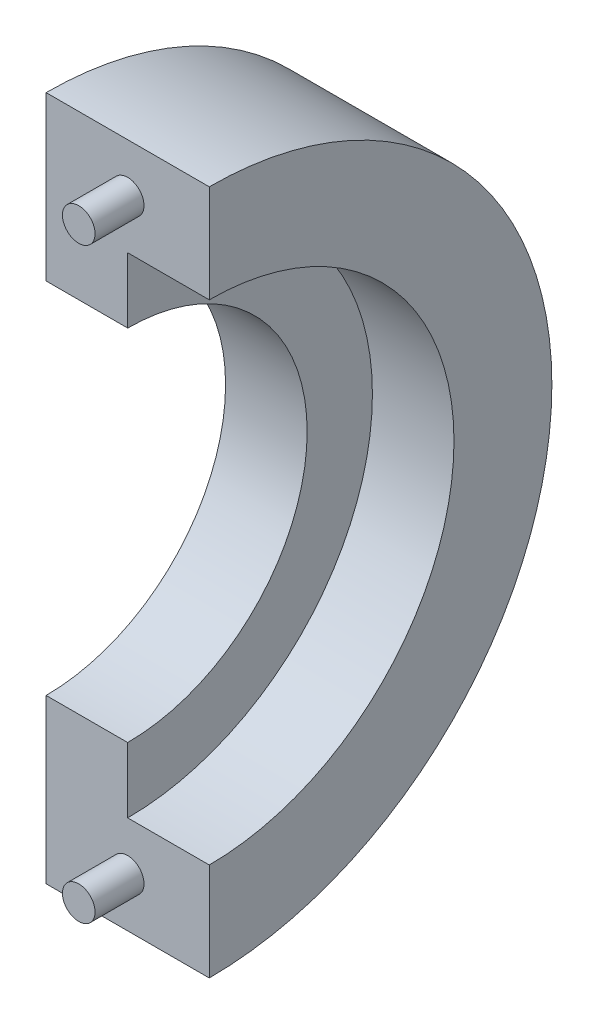
ISO-10303-21;
HEADER;
FILE_DESCRIPTION(('STEP AP214'),'2;1');
FILE_NAME('part.step','',(''),(''),'','','');
FILE_SCHEMA(('AUTOMOTIVE_DESIGN { 1 0 10303 214 1 1 1 1 }'));
ENDSEC;
DATA;
#1=APPLICATION_CONTEXT('core data for automotive mechanical design processes');
#2=APPLICATION_PROTOCOL_DEFINITION('international standard','automotive_design',2000,#1);
#3=PRODUCT_CONTEXT('',#1,'mechanical');
#4=PRODUCT('Part','Part','',(#3));
#5=PRODUCT_RELATED_PRODUCT_CATEGORY('part','',(#4));
#6=PRODUCT_DEFINITION_FORMATION('','',#4);
#7=PRODUCT_DEFINITION_CONTEXT('part definition',#1,'design');
#8=PRODUCT_DEFINITION('design','',#6,#7);
#9=PRODUCT_DEFINITION_SHAPE('','',#8);
#10=(LENGTH_UNIT() NAMED_UNIT(*) SI_UNIT(.MILLI.,.METRE.));
#11=(NAMED_UNIT(*) PLANE_ANGLE_UNIT() SI_UNIT($,.RADIAN.));
#12=(NAMED_UNIT(*) SI_UNIT($,.STERADIAN.) SOLID_ANGLE_UNIT());
#13=UNCERTAINTY_MEASURE_WITH_UNIT(LENGTH_MEASURE(1.E-05),#10,'distance_accuracy_value','');
#14=(GEOMETRIC_REPRESENTATION_CONTEXT(3) GLOBAL_UNCERTAINTY_ASSIGNED_CONTEXT((#13)) GLOBAL_UNIT_ASSIGNED_CONTEXT((#10,
#11,#12)) REPRESENTATION_CONTEXT('',''));
#15=CARTESIAN_POINT('',(0.,0.,0.));
#16=DIRECTION('',(0.,0.,1.));
#17=DIRECTION('',(1.,0.,0.));
#18=AXIS2_PLACEMENT_3D('',#15,#16,#17);
#19=CARTESIAN_POINT('',(-5.,-5.5,0.));
#20=DIRECTION('',(-1.,0.,0.));
#21=DIRECTION('',(0.,0.,1.));
#22=AXIS2_PLACEMENT_3D('',#19,#20,#21);
#23=PLANE('',#22);
#24=CARTESIAN_POINT('',(-5.,0.,0.));
#25=DIRECTION('',(1.,0.,0.));
#26=DIRECTION('',(0.,0.,-1.));
#27=AXIS2_PLACEMENT_3D('',#24,#25,#26);
#28=CIRCLE('',#27,5.5);
#29=CARTESIAN_POINT('',(-5.,-5.5,0.));
#30=VERTEX_POINT('',#29);
#31=CARTESIAN_POINT('',(-5.,5.5,0.));
#32=VERTEX_POINT('',#31);
#33=EDGE_CURVE('E11',#30,#32,#28,.T.);
#34=ORIENTED_EDGE('',*,*,#33,.T.);
#35=DIRECTION('',(0.,-1.,0.));
#36=VECTOR('',#35,1.);
#37=CARTESIAN_POINT('',(-5.,5.5,0.));
#38=LINE('',#37,#36);
#39=CARTESIAN_POINT('',(-5.,10.5,0.));
#40=VERTEX_POINT('',#39);
#41=EDGE_CURVE('E84',#40,#32,#38,.T.);
#42=ORIENTED_EDGE('',*,*,#41,.F.);
#43=CARTESIAN_POINT('',(-5.,0.,0.));
#44=DIRECTION('',(1.,0.,0.));
#45=DIRECTION('',(0.,0.,-1.));
#46=AXIS2_PLACEMENT_3D('',#43,#44,#45);
#47=CIRCLE('',#46,10.5);
#48=CARTESIAN_POINT('',(-5.,-10.5,0.));
#49=VERTEX_POINT('',#48);
#50=EDGE_CURVE('E47',#49,#40,#47,.T.);
#51=ORIENTED_EDGE('',*,*,#50,.F.);
#52=DIRECTION('',(0.,1.,0.));
#53=VECTOR('',#52,1.);
#54=CARTESIAN_POINT('',(-5.,-5.5,0.));
#55=LINE('',#54,#53);
#56=EDGE_CURVE('E86',#49,#30,#55,.T.);
#57=ORIENTED_EDGE('',*,*,#56,.T.);
#58=EDGE_LOOP('',(#34,#42,#51,#57));
#59=FACE_BOUND('',#58,.T.);
#60=ADVANCED_FACE('F32',(#59),#23,.T.);
#61=CARTESIAN_POINT('',(0.,0.,0.));
#62=DIRECTION('',(1.,0.,0.));
#63=DIRECTION('',(0.,0.,-1.));
#64=AXIS2_PLACEMENT_3D('',#61,#62,#63);
#65=CYLINDRICAL_SURFACE('',#64,5.5);
#66=CARTESIAN_POINT('',(-2.5,0.,0.));
#67=DIRECTION('',(1.,0.,0.));
#68=DIRECTION('',(0.,0.,-1.));
#69=AXIS2_PLACEMENT_3D('',#66,#67,#68);
#70=CIRCLE('',#69,5.5);
#71=CARTESIAN_POINT('',(-2.5,-5.5,0.));
#72=VERTEX_POINT('',#71);
#73=CARTESIAN_POINT('',(-2.5,5.5,0.));
#74=VERTEX_POINT('',#73);
#75=EDGE_CURVE('E40',#72,#74,#70,.T.);
#76=ORIENTED_EDGE('',*,*,#75,.T.);
#77=DIRECTION('',(1.,0.,0.));
#78=VECTOR('',#77,1.);
#79=CARTESIAN_POINT('',(-2.5,5.5,0.));
#80=LINE('',#79,#78);
#81=EDGE_CURVE('E95',#32,#74,#80,.T.);
#82=ORIENTED_EDGE('',*,*,#81,.F.);
#83=ORIENTED_EDGE('',*,*,#33,.F.);
#84=DIRECTION('',(1.,0.,0.));
#85=VECTOR('',#84,1.);
#86=CARTESIAN_POINT('',(-2.5,-5.5,0.));
#87=LINE('',#86,#85);
#88=EDGE_CURVE('E113',#30,#72,#87,.T.);
#89=ORIENTED_EDGE('',*,*,#88,.T.);
#90=EDGE_LOOP('',(#76,#82,#83,#89));
#91=FACE_BOUND('',#90,.T.);
#92=ADVANCED_FACE('F34',(#91),#65,.F.);
#93=CARTESIAN_POINT('',(-2.5,-5.5,0.));
#94=DIRECTION('',(1.,0.,0.));
#95=DIRECTION('',(0.,0.,-1.));
#96=AXIS2_PLACEMENT_3D('',#93,#94,#95);
#97=PLANE('',#96);
#98=CARTESIAN_POINT('',(-2.5,0.,0.));
#99=DIRECTION('',(1.,0.,0.));
#100=DIRECTION('',(0.,0.,-1.));
#101=AXIS2_PLACEMENT_3D('',#98,#99,#100);
#102=CIRCLE('',#101,7.5);
#103=CARTESIAN_POINT('',(-2.5,-7.5,0.));
#104=VERTEX_POINT('',#103);
#105=CARTESIAN_POINT('',(-2.5,7.5,0.));
#106=VERTEX_POINT('',#105);
#107=EDGE_CURVE('E129',#104,#106,#102,.T.);
#108=ORIENTED_EDGE('',*,*,#107,.T.);
#109=DIRECTION('',(0.,1.,0.));
#110=VECTOR('',#109,1.);
#111=CARTESIAN_POINT('',(-2.5,5.5,0.));
#112=LINE('',#111,#110);
#113=EDGE_CURVE('E101',#74,#106,#112,.T.);
#114=ORIENTED_EDGE('',*,*,#113,.F.);
#115=ORIENTED_EDGE('',*,*,#75,.F.);
#116=DIRECTION('',(0.,-1.,0.));
#117=VECTOR('',#116,1.);
#118=CARTESIAN_POINT('',(-2.5,-5.5,0.));
#119=LINE('',#118,#117);
#120=EDGE_CURVE('E115',#72,#104,#119,.T.);
#121=ORIENTED_EDGE('',*,*,#120,.T.);
#122=EDGE_LOOP('',(#108,#114,#115,#121));
#123=FACE_BOUND('',#122,.T.);
#124=ADVANCED_FACE('F131',(#123),#97,.T.);
#125=CARTESIAN_POINT('',(0.,0.,0.));
#126=DIRECTION('',(1.,0.,0.));
#127=DIRECTION('',(0.,0.,-1.));
#128=AXIS2_PLACEMENT_3D('',#125,#126,#127);
#129=CYLINDRICAL_SURFACE('',#128,7.5);
#130=CARTESIAN_POINT('',(0.,0.,0.));
#131=DIRECTION('',(1.,0.,0.));
#132=DIRECTION('',(0.,0.,-1.));
#133=AXIS2_PLACEMENT_3D('',#130,#131,#132);
#134=CIRCLE('',#133,7.5);
#135=CARTESIAN_POINT('',(0.,-7.5,0.));
#136=VERTEX_POINT('',#135);
#137=CARTESIAN_POINT('',(0.,7.5,0.));
#138=VERTEX_POINT('',#137);
#139=EDGE_CURVE('E127',#136,#138,#134,.T.);
#140=ORIENTED_EDGE('',*,*,#139,.T.);
#141=DIRECTION('',(1.,0.,0.));
#142=VECTOR('',#141,1.);
#143=CARTESIAN_POINT('',(0.,7.5,0.));
#144=LINE('',#143,#142);
#145=EDGE_CURVE('E103',#106,#138,#144,.T.);
#146=ORIENTED_EDGE('',*,*,#145,.F.);
#147=ORIENTED_EDGE('',*,*,#107,.F.);
#148=DIRECTION('',(1.,0.,0.));
#149=VECTOR('',#148,1.);
#150=CARTESIAN_POINT('',(0.,-7.5,0.));
#151=LINE('',#150,#149);
#152=EDGE_CURVE('E118',#104,#136,#151,.T.);
#153=ORIENTED_EDGE('',*,*,#152,.T.);
#154=EDGE_LOOP('',(#140,#146,#147,#153));
#155=FACE_BOUND('',#154,.T.);
#156=ADVANCED_FACE('F137',(#155),#129,.F.);
#157=CARTESIAN_POINT('',(0.,-7.5,0.));
#158=DIRECTION('',(1.,0.,0.));
#159=DIRECTION('',(0.,0.,-1.));
#160=AXIS2_PLACEMENT_3D('',#157,#158,#159);
#161=PLANE('',#160);
#162=CARTESIAN_POINT('',(0.,0.,0.));
#163=DIRECTION('',(1.,0.,0.));
#164=DIRECTION('',(0.,0.,-1.));
#165=AXIS2_PLACEMENT_3D('',#162,#163,#164);
#166=CIRCLE('',#165,10.5);
#167=CARTESIAN_POINT('',(0.,-10.5,0.));
#168=VERTEX_POINT('',#167);
#169=CARTESIAN_POINT('',(0.,10.5,0.));
#170=VERTEX_POINT('',#169);
#171=EDGE_CURVE('E55',#168,#170,#166,.T.);
#172=ORIENTED_EDGE('',*,*,#171,.T.);
#173=DIRECTION('',(0.,1.,0.));
#174=VECTOR('',#173,1.);
#175=CARTESIAN_POINT('',(0.,7.5,0.));
#176=LINE('',#175,#174);
#177=EDGE_CURVE('E109',#138,#170,#176,.T.);
#178=ORIENTED_EDGE('',*,*,#177,.F.);
#179=ORIENTED_EDGE('',*,*,#139,.F.);
#180=DIRECTION('',(0.,-1.,0.));
#181=VECTOR('',#180,1.);
#182=CARTESIAN_POINT('',(0.,-7.5,0.));
#183=LINE('',#182,#181);
#184=EDGE_CURVE('E121',#136,#168,#183,.T.);
#185=ORIENTED_EDGE('',*,*,#184,.T.);
#186=EDGE_LOOP('',(#172,#178,#179,#185));
#187=FACE_BOUND('',#186,.T.);
#188=ADVANCED_FACE('F140',(#187),#161,.T.);
#189=CARTESIAN_POINT('',(0.,0.,0.));
#190=DIRECTION('',(1.,0.,0.));
#191=DIRECTION('',(0.,0.,-1.));
#192=AXIS2_PLACEMENT_3D('',#189,#190,#191);
#193=CYLINDRICAL_SURFACE('',#192,10.5);
#194=DIRECTION('',(-1.,0.,0.));
#195=VECTOR('',#194,1.);
#196=CARTESIAN_POINT('',(0.,-10.5,0.));
#197=LINE('',#196,#195);
#198=EDGE_CURVE('E123',#168,#49,#197,.T.);
#199=ORIENTED_EDGE('',*,*,#198,.T.);
#200=ORIENTED_EDGE('',*,*,#50,.T.);
#201=DIRECTION('',(-1.,0.,0.));
#202=VECTOR('',#201,1.);
#203=CARTESIAN_POINT('',(0.,10.5,0.));
#204=LINE('',#203,#202);
#205=EDGE_CURVE('E98',#170,#40,#204,.T.);
#206=ORIENTED_EDGE('',*,*,#205,.F.);
#207=ORIENTED_EDGE('',*,*,#171,.F.);
#208=EDGE_LOOP('',(#199,#200,#206,#207));
#209=FACE_BOUND('',#208,.T.);
#210=ADVANCED_FACE('F142',(#209),#193,.T.);
#211=CARTESIAN_POINT('',(0.,0.,0.));
#212=DIRECTION('',(0.,0.,-1.));
#213=DIRECTION('',(1.,0.,0.));
#214=AXIS2_PLACEMENT_3D('',#211,#212,#213);
#215=PLANE('',#214);
#216=CARTESIAN_POINT('',(-2.5,-9.,0.));
#217=DIRECTION('',(0.,0.,-1.));
#218=DIRECTION('',(1.,0.,0.));
#219=AXIS2_PLACEMENT_3D('',#216,#217,#218);
#220=CIRCLE('',#219,0.5);
#221=CARTESIAN_POINT('',(-2.,-9.,0.));
#222=VERTEX_POINT('',#221);
#223=EDGE_CURVE('E240',#222,#222,#220,.T.);
#224=ORIENTED_EDGE('',*,*,#223,.T.);
#225=EDGE_LOOP('',(#224));
#226=FACE_BOUND('',#225,.T.);
#227=ORIENTED_EDGE('',*,*,#56,.F.);
#228=ORIENTED_EDGE('',*,*,#198,.F.);
#229=ORIENTED_EDGE('',*,*,#184,.F.);
#230=ORIENTED_EDGE('',*,*,#152,.F.);
#231=ORIENTED_EDGE('',*,*,#120,.F.);
#232=ORIENTED_EDGE('',*,*,#88,.F.);
#233=EDGE_LOOP('',(#227,#228,#229,#230,#231,#232));
#234=FACE_BOUND('',#233,.T.);
#235=ADVANCED_FACE('F144',(#226,#234),#215,.F.);
#236=CARTESIAN_POINT('',(0.,0.,0.));
#237=DIRECTION('',(0.,0.,1.));
#238=DIRECTION('',(1.,0.,0.));
#239=AXIS2_PLACEMENT_3D('',#236,#237,#238);
#240=PLANE('',#239);
#241=CARTESIAN_POINT('',(-2.5,9.,0.));
#242=DIRECTION('',(0.,0.,1.));
#243=DIRECTION('',(1.,0.,0.));
#244=AXIS2_PLACEMENT_3D('',#241,#242,#243);
#245=CIRCLE('',#244,0.5);
#246=CARTESIAN_POINT('',(-2.,9.,0.));
#247=VERTEX_POINT('',#246);
#248=EDGE_CURVE('E239',#247,#247,#245,.T.);
#249=ORIENTED_EDGE('',*,*,#248,.F.);
#250=EDGE_LOOP('',(#249));
#251=FACE_BOUND('',#250,.T.);
#252=ORIENTED_EDGE('',*,*,#41,.T.);
#253=ORIENTED_EDGE('',*,*,#81,.T.);
#254=ORIENTED_EDGE('',*,*,#113,.T.);
#255=ORIENTED_EDGE('',*,*,#145,.T.);
#256=ORIENTED_EDGE('',*,*,#177,.T.);
#257=ORIENTED_EDGE('',*,*,#205,.T.);
#258=EDGE_LOOP('',(#252,#253,#254,#255,#256,#257));
#259=FACE_BOUND('',#258,.T.);
#260=ADVANCED_FACE('F93',(#251,#259),#240,.T.);
#261=CARTESIAN_POINT('',(-2.5,9.,1.5));
#262=DIRECTION('',(0.,0.,-1.));
#263=DIRECTION('',(-1.,0.,0.));
#264=AXIS2_PLACEMENT_3D('',#261,#262,#263);
#265=CYLINDRICAL_SURFACE('',#264,0.5);
#266=CARTESIAN_POINT('',(-2.5,9.,1.5));
#267=DIRECTION('',(0.,0.,1.));
#268=DIRECTION('',(1.,0.,0.));
#269=AXIS2_PLACEMENT_3D('',#266,#267,#268);
#270=CIRCLE('',#269,0.5);
#271=CARTESIAN_POINT('',(-2.,9.,1.5));
#272=VERTEX_POINT('',#271);
#273=EDGE_CURVE('E99',#272,#272,#270,.T.);
#274=ORIENTED_EDGE('',*,*,#273,.F.);
#275=EDGE_LOOP('',(#274));
#276=FACE_BOUND('',#275,.T.);
#277=ORIENTED_EDGE('',*,*,#248,.T.);
#278=EDGE_LOOP('',(#277));
#279=FACE_BOUND('',#278,.T.);
#280=ADVANCED_FACE('F152',(#276,#279),#265,.T.);
#281=CARTESIAN_POINT('',(-2.5,9.,1.5));
#282=DIRECTION('',(0.,0.,1.));
#283=DIRECTION('',(1.,0.,0.));
#284=AXIS2_PLACEMENT_3D('',#281,#282,#283);
#285=PLANE('',#284);
#286=ORIENTED_EDGE('',*,*,#273,.T.);
#287=EDGE_LOOP('',(#286));
#288=FACE_BOUND('',#287,.T.);
#289=ADVANCED_FACE('F199',(#288),#285,.T.);
#290=CARTESIAN_POINT('',(-2.5,-9.,1.5));
#291=DIRECTION('',(0.,0.,-1.));
#292=DIRECTION('',(-1.,0.,0.));
#293=AXIS2_PLACEMENT_3D('',#290,#291,#292);
#294=CYLINDRICAL_SURFACE('',#293,0.5);
#295=CARTESIAN_POINT('',(-2.5,-9.,1.5));
#296=DIRECTION('',(0.,0.,-1.));
#297=DIRECTION('',(1.,0.,0.));
#298=AXIS2_PLACEMENT_3D('',#295,#296,#297);
#299=CIRCLE('',#298,0.5);
#300=CARTESIAN_POINT('',(-2.,-9.,1.5));
#301=VERTEX_POINT('',#300);
#302=EDGE_CURVE('E238',#301,#301,#299,.T.);
#303=ORIENTED_EDGE('',*,*,#302,.T.);
#304=EDGE_LOOP('',(#303));
#305=FACE_BOUND('',#304,.T.);
#306=ORIENTED_EDGE('',*,*,#223,.F.);
#307=EDGE_LOOP('',(#306));
#308=FACE_BOUND('',#307,.T.);
#309=ADVANCED_FACE('F208',(#305,#308),#294,.T.);
#310=CARTESIAN_POINT('',(-2.5,-9.,1.5));
#311=DIRECTION('',(0.,0.,1.));
#312=DIRECTION('',(1.,0.,0.));
#313=AXIS2_PLACEMENT_3D('',#310,#311,#312);
#314=PLANE('',#313);
#315=ORIENTED_EDGE('',*,*,#302,.F.);
#316=EDGE_LOOP('',(#315));
#317=FACE_BOUND('',#316,.T.);
#318=ADVANCED_FACE('F222',(#317),#314,.T.);
#319=CLOSED_SHELL('',(#60,#92,#124,#156,#188,#210,#235,#260,#280,#289,#309,#318));
#320=MANIFOLD_SOLID_BREP('B2',#319);
#321=ADVANCED_BREP_SHAPE_REPRESENTATION('',(#18,#320),#14);
#322=SHAPE_DEFINITION_REPRESENTATION(#9,#321);
ENDSEC;
END-ISO-10303-21;
